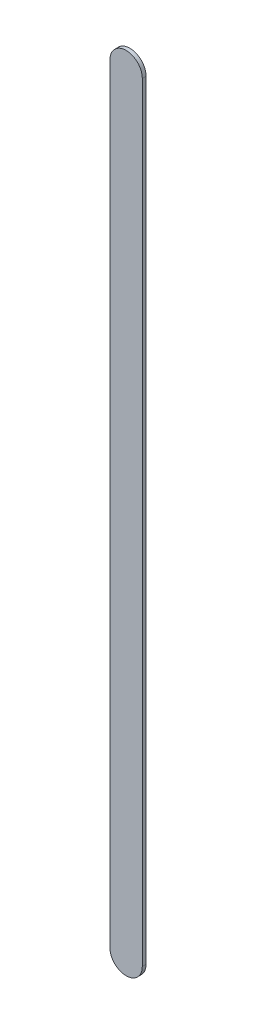
ISO-10303-21;
HEADER;
FILE_DESCRIPTION(('STEP AP214'),'2;1');
FILE_NAME('part.step','',(''),(''),'','','');
FILE_SCHEMA(('AUTOMOTIVE_DESIGN { 1 0 10303 214 1 1 1 1 }'));
ENDSEC;
DATA;
#1=APPLICATION_CONTEXT('core data for automotive mechanical design processes');
#2=APPLICATION_PROTOCOL_DEFINITION('international standard','automotive_design',2000,#1);
#3=PRODUCT_CONTEXT('',#1,'mechanical');
#4=PRODUCT('Part','Part','',(#3));
#5=PRODUCT_RELATED_PRODUCT_CATEGORY('part','',(#4));
#6=PRODUCT_DEFINITION_FORMATION('','',#4);
#7=PRODUCT_DEFINITION_CONTEXT('part definition',#1,'design');
#8=PRODUCT_DEFINITION('design','',#6,#7);
#9=PRODUCT_DEFINITION_SHAPE('','',#8);
#10=(LENGTH_UNIT() NAMED_UNIT(*) SI_UNIT(.MILLI.,.METRE.));
#11=(NAMED_UNIT(*) PLANE_ANGLE_UNIT() SI_UNIT($,.RADIAN.));
#12=(NAMED_UNIT(*) SI_UNIT($,.STERADIAN.) SOLID_ANGLE_UNIT());
#13=UNCERTAINTY_MEASURE_WITH_UNIT(LENGTH_MEASURE(1.E-05),#10,'distance_accuracy_value','');
#14=(GEOMETRIC_REPRESENTATION_CONTEXT(3) GLOBAL_UNCERTAINTY_ASSIGNED_CONTEXT((#13)) GLOBAL_UNIT_ASSIGNED_CONTEXT((#10,
#11,#12)) REPRESENTATION_CONTEXT('',''));
#15=CARTESIAN_POINT('',(0.,0.,0.));
#16=DIRECTION('',(0.,0.,1.));
#17=DIRECTION('',(1.,0.,0.));
#18=AXIS2_PLACEMENT_3D('',#15,#16,#17);
#19=CARTESIAN_POINT('',(122.23,-78.19,1.635));
#20=DIRECTION('',(0.,0.,1.));
#21=DIRECTION('',(1.,0.,0.));
#22=AXIS2_PLACEMENT_3D('',#19,#20,#21);
#23=PLANE('',#22);
#24=DIRECTION('',(0.,-1.,0.));
#25=VECTOR('',#24,1.);
#26=CARTESIAN_POINT('',(122.23,-78.19,1.635));
#27=LINE('',#26,#25);
#28=CARTESIAN_POINT('',(122.23,-78.19,1.635));
#29=VERTEX_POINT('',#28);
#30=CARTESIAN_POINT('',(122.23,-85.32,1.635));
#31=VERTEX_POINT('',#30);
#32=EDGE_CURVE('E94',#29,#31,#27,.T.);
#33=ORIENTED_EDGE('',*,*,#32,.T.);
#34=CARTESIAN_POINT('',(122.38,-85.32,1.635));
#35=DIRECTION('',(0.,0.,1.));
#36=DIRECTION('',(-1.,0.,0.));
#37=AXIS2_PLACEMENT_3D('',#34,#35,#36);
#38=CIRCLE('',#37,0.15);
#39=CARTESIAN_POINT('',(122.53,-85.32,1.635));
#40=VERTEX_POINT('',#39);
#41=EDGE_CURVE('E72',#31,#40,#38,.T.);
#42=ORIENTED_EDGE('',*,*,#41,.T.);
#43=DIRECTION('',(0.,1.,0.));
#44=VECTOR('',#43,1.);
#45=CARTESIAN_POINT('',(122.53,-85.32,1.635));
#46=LINE('',#45,#44);
#47=CARTESIAN_POINT('',(122.53,-78.19,1.635));
#48=VERTEX_POINT('',#47);
#49=EDGE_CURVE('E77',#40,#48,#46,.T.);
#50=ORIENTED_EDGE('',*,*,#49,.T.);
#51=CARTESIAN_POINT('',(122.38,-78.19,1.635));
#52=DIRECTION('',(0.,0.,1.));
#53=DIRECTION('',(1.,0.,0.));
#54=AXIS2_PLACEMENT_3D('',#51,#52,#53);
#55=CIRCLE('',#54,0.15);
#56=EDGE_CURVE('E11',#48,#29,#55,.T.);
#57=ORIENTED_EDGE('',*,*,#56,.T.);
#58=EDGE_LOOP('',(#33,#42,#50,#57));
#59=FACE_BOUND('',#58,.T.);
#60=ADVANCED_FACE('F17',(#59),#23,.T.);
#61=CARTESIAN_POINT('',(122.23,-78.19,1.6));
#62=DIRECTION('',(0.,0.,1.));
#63=DIRECTION('',(1.,0.,0.));
#64=AXIS2_PLACEMENT_3D('',#61,#62,#63);
#65=PLANE('',#64);
#66=CARTESIAN_POINT('',(122.38,-78.19,1.6));
#67=DIRECTION('',(0.,0.,1.));
#68=DIRECTION('',(1.,0.,0.));
#69=AXIS2_PLACEMENT_3D('',#66,#67,#68);
#70=CIRCLE('',#69,0.15);
#71=CARTESIAN_POINT('',(122.53,-78.19,1.6));
#72=VERTEX_POINT('',#71);
#73=CARTESIAN_POINT('',(122.23,-78.19,1.6));
#74=VERTEX_POINT('',#73);
#75=EDGE_CURVE('E20',#72,#74,#70,.T.);
#76=ORIENTED_EDGE('',*,*,#75,.F.);
#77=DIRECTION('',(0.,1.,0.));
#78=VECTOR('',#77,1.);
#79=CARTESIAN_POINT('',(122.53,-85.32,1.6));
#80=LINE('',#79,#78);
#81=CARTESIAN_POINT('',(122.53,-85.32,1.6));
#82=VERTEX_POINT('',#81);
#83=EDGE_CURVE('E61',#82,#72,#80,.T.);
#84=ORIENTED_EDGE('',*,*,#83,.F.);
#85=CARTESIAN_POINT('',(122.38,-85.32,1.6));
#86=DIRECTION('',(0.,0.,1.));
#87=DIRECTION('',(-1.,0.,0.));
#88=AXIS2_PLACEMENT_3D('',#85,#86,#87);
#89=CIRCLE('',#88,0.15);
#90=CARTESIAN_POINT('',(122.23,-85.32,1.6));
#91=VERTEX_POINT('',#90);
#92=EDGE_CURVE('E66',#91,#82,#89,.T.);
#93=ORIENTED_EDGE('',*,*,#92,.F.);
#94=DIRECTION('',(0.,-1.,0.));
#95=VECTOR('',#94,1.);
#96=CARTESIAN_POINT('',(122.23,-78.19,1.6));
#97=LINE('',#96,#95);
#98=EDGE_CURVE('E115',#74,#91,#97,.T.);
#99=ORIENTED_EDGE('',*,*,#98,.F.);
#100=EDGE_LOOP('',(#76,#84,#93,#99));
#101=FACE_BOUND('',#100,.T.);
#102=ADVANCED_FACE('F63',(#101),#65,.F.);
#103=CARTESIAN_POINT('',(122.38,-78.19,1.6));
#104=DIRECTION('',(0.,0.,-1.));
#105=DIRECTION('',(1.,0.,0.));
#106=AXIS2_PLACEMENT_3D('',#103,#104,#105);
#107=CYLINDRICAL_SURFACE('',#106,0.15);
#108=ORIENTED_EDGE('',*,*,#75,.T.);
#109=DIRECTION('',(0.,0.,1.));
#110=VECTOR('',#109,1.);
#111=CARTESIAN_POINT('',(122.23,-78.19,1.6));
#112=LINE('',#111,#110);
#113=EDGE_CURVE('E88',#74,#29,#112,.T.);
#114=ORIENTED_EDGE('',*,*,#113,.T.);
#115=ORIENTED_EDGE('',*,*,#56,.F.);
#116=DIRECTION('',(0.,0.,1.));
#117=VECTOR('',#116,1.);
#118=CARTESIAN_POINT('',(122.53,-78.19,1.6));
#119=LINE('',#118,#117);
#120=EDGE_CURVE('E71',#72,#48,#119,.T.);
#121=ORIENTED_EDGE('',*,*,#120,.F.);
#122=EDGE_LOOP('',(#108,#114,#115,#121));
#123=FACE_BOUND('',#122,.T.);
#124=ADVANCED_FACE('F109',(#123),#107,.T.);
#125=CARTESIAN_POINT('',(122.53,-85.32,1.6));
#126=DIRECTION('',(-1.,0.,0.));
#127=DIRECTION('',(0.,0.,1.));
#128=AXIS2_PLACEMENT_3D('',#125,#126,#127);
#129=PLANE('',#128);
#130=ORIENTED_EDGE('',*,*,#83,.T.);
#131=ORIENTED_EDGE('',*,*,#120,.T.);
#132=ORIENTED_EDGE('',*,*,#49,.F.);
#133=DIRECTION('',(0.,0.,1.));
#134=VECTOR('',#133,1.);
#135=CARTESIAN_POINT('',(122.53,-85.32,1.6));
#136=LINE('',#135,#134);
#137=EDGE_CURVE('E75',#82,#40,#136,.T.);
#138=ORIENTED_EDGE('',*,*,#137,.F.);
#139=EDGE_LOOP('',(#130,#131,#132,#138));
#140=FACE_BOUND('',#139,.T.);
#141=ADVANCED_FACE('F76',(#140),#129,.F.);
#142=CARTESIAN_POINT('',(122.38,-85.32,1.6));
#143=DIRECTION('',(0.,0.,-1.));
#144=DIRECTION('',(-1.,0.,0.));
#145=AXIS2_PLACEMENT_3D('',#142,#143,#144);
#146=CYLINDRICAL_SURFACE('',#145,0.15);
#147=ORIENTED_EDGE('',*,*,#92,.T.);
#148=ORIENTED_EDGE('',*,*,#137,.T.);
#149=ORIENTED_EDGE('',*,*,#41,.F.);
#150=DIRECTION('',(0.,0.,1.));
#151=VECTOR('',#150,1.);
#152=CARTESIAN_POINT('',(122.23,-85.32,1.6));
#153=LINE('',#152,#151);
#154=EDGE_CURVE('E85',#91,#31,#153,.T.);
#155=ORIENTED_EDGE('',*,*,#154,.F.);
#156=EDGE_LOOP('',(#147,#148,#149,#155));
#157=FACE_BOUND('',#156,.T.);
#158=ADVANCED_FACE('F83',(#157),#146,.T.);
#159=CARTESIAN_POINT('',(122.23,-78.19,1.6));
#160=DIRECTION('',(1.,0.,0.));
#161=DIRECTION('',(0.,1.,0.));
#162=AXIS2_PLACEMENT_3D('',#159,#160,#161);
#163=PLANE('',#162);
#164=ORIENTED_EDGE('',*,*,#98,.T.);
#165=ORIENTED_EDGE('',*,*,#154,.T.);
#166=ORIENTED_EDGE('',*,*,#32,.F.);
#167=ORIENTED_EDGE('',*,*,#113,.F.);
#168=EDGE_LOOP('',(#164,#165,#166,#167));
#169=FACE_BOUND('',#168,.T.);
#170=ADVANCED_FACE('F114',(#169),#163,.F.);
#171=CLOSED_SHELL('',(#60,#102,#124,#141,#158,#170));
#172=MANIFOLD_SOLID_BREP('B1',#171);
#173=ADVANCED_BREP_SHAPE_REPRESENTATION('',(#18,#172),#14);
#174=SHAPE_DEFINITION_REPRESENTATION(#9,#173);
ENDSEC;
END-ISO-10303-21;
